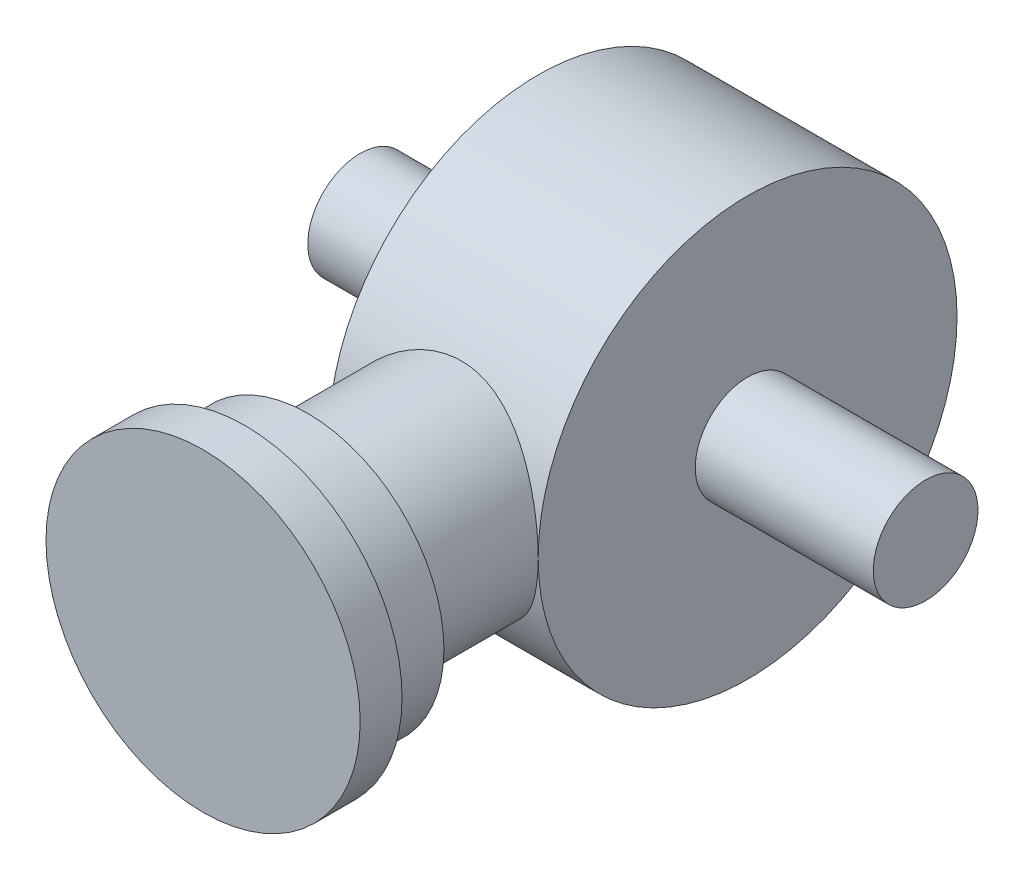
ISO-10303-21;
HEADER;
FILE_DESCRIPTION(('STEP AP214'),'2;1');
FILE_NAME('part.step','',(''),(''),'','','');
FILE_SCHEMA(('AUTOMOTIVE_DESIGN { 1 0 10303 214 1 1 1 1 }'));
ENDSEC;
DATA;
#1=APPLICATION_CONTEXT('core data for automotive mechanical design processes');
#2=APPLICATION_PROTOCOL_DEFINITION('international standard','automotive_design',2000,#1);
#3=PRODUCT_CONTEXT('',#1,'mechanical');
#4=PRODUCT('Part','Part','',(#3));
#5=PRODUCT_RELATED_PRODUCT_CATEGORY('part','',(#4));
#6=PRODUCT_DEFINITION_FORMATION('','',#4);
#7=PRODUCT_DEFINITION_CONTEXT('part definition',#1,'design');
#8=PRODUCT_DEFINITION('design','',#6,#7);
#9=PRODUCT_DEFINITION_SHAPE('','',#8);
#10=(LENGTH_UNIT() NAMED_UNIT(*) SI_UNIT(.MILLI.,.METRE.));
#11=(NAMED_UNIT(*) PLANE_ANGLE_UNIT() SI_UNIT($,.RADIAN.));
#12=(NAMED_UNIT(*) SI_UNIT($,.STERADIAN.) SOLID_ANGLE_UNIT());
#13=UNCERTAINTY_MEASURE_WITH_UNIT(LENGTH_MEASURE(1.E-05),#10,'distance_accuracy_value','');
#14=(GEOMETRIC_REPRESENTATION_CONTEXT(3) GLOBAL_UNCERTAINTY_ASSIGNED_CONTEXT((#13)) GLOBAL_UNIT_ASSIGNED_CONTEXT((#10,
#11,#12)) REPRESENTATION_CONTEXT('',''));
#15=CARTESIAN_POINT('',(0.,0.,0.));
#16=DIRECTION('',(0.,0.,1.));
#17=DIRECTION('',(1.,0.,0.));
#18=AXIS2_PLACEMENT_3D('',#15,#16,#17);
#19=CARTESIAN_POINT('',(12.7,0.,0.));
#20=DIRECTION('',(1.,0.,0.));
#21=DIRECTION('',(0.,0.,-1.));
#22=AXIS2_PLACEMENT_3D('',#19,#20,#21);
#23=PLANE('',#22);
#24=CARTESIAN_POINT('',(12.7,0.,0.));
#25=DIRECTION('',(1.,0.,0.));
#26=DIRECTION('',(0.,0.,-1.));
#27=AXIS2_PLACEMENT_3D('',#24,#25,#26);
#28=CIRCLE('',#27,25.4);
#29=CARTESIAN_POINT('',(12.7,0.,25.4));
#30=VERTEX_POINT('',#29);
#31=EDGE_CURVE('E47',#30,#30,#28,.T.);
#32=ORIENTED_EDGE('',*,*,#31,.T.);
#33=EDGE_LOOP('',(#32));
#34=FACE_BOUND('',#33,.T.);
#35=CARTESIAN_POINT('',(12.7,0.,0.));
#36=DIRECTION('',(1.,0.,0.));
#37=DIRECTION('',(0.,0.,-1.));
#38=AXIS2_PLACEMENT_3D('',#35,#36,#37);
#39=CIRCLE('',#38,6.35);
#40=CARTESIAN_POINT('',(12.7,0.,-6.35));
#41=VERTEX_POINT('',#40);
#42=EDGE_CURVE('E142',#41,#41,#39,.F.);
#43=ORIENTED_EDGE('',*,*,#42,.T.);
#44=EDGE_LOOP('',(#43));
#45=FACE_BOUND('',#44,.T.);
#46=ADVANCED_FACE('F39',(#34,#45),#23,.T.);
#47=CARTESIAN_POINT('',(-12.7,0.,0.));
#48=DIRECTION('',(1.,0.,0.));
#49=DIRECTION('',(0.,0.,-1.));
#50=AXIS2_PLACEMENT_3D('',#47,#48,#49);
#51=PLANE('',#50);
#52=CARTESIAN_POINT('',(-12.7,0.,0.));
#53=DIRECTION('',(1.,0.,0.));
#54=DIRECTION('',(0.,0.,-1.));
#55=AXIS2_PLACEMENT_3D('',#52,#53,#54);
#56=CIRCLE('',#55,25.4);
#57=CARTESIAN_POINT('',(-12.7,0.,25.4));
#58=VERTEX_POINT('',#57);
#59=EDGE_CURVE('E64',#58,#58,#56,.T.);
#60=ORIENTED_EDGE('',*,*,#59,.F.);
#61=EDGE_LOOP('',(#60));
#62=FACE_BOUND('',#61,.T.);
#63=CARTESIAN_POINT('',(-12.7,0.,0.));
#64=DIRECTION('',(1.,0.,0.));
#65=DIRECTION('',(0.,0.,-1.));
#66=AXIS2_PLACEMENT_3D('',#63,#64,#65);
#67=CIRCLE('',#66,6.35);
#68=CARTESIAN_POINT('',(-12.7,0.,-6.35));
#69=VERTEX_POINT('',#68);
#70=EDGE_CURVE('E11',#69,#69,#67,.F.);
#71=ORIENTED_EDGE('',*,*,#70,.F.);
#72=EDGE_LOOP('',(#71));
#73=FACE_BOUND('',#72,.T.);
#74=ADVANCED_FACE('F81',(#62,#73),#51,.F.);
#75=CARTESIAN_POINT('',(12.7,0.,0.));
#76=DIRECTION('',(-1.,0.,0.));
#77=DIRECTION('',(0.,0.,1.));
#78=AXIS2_PLACEMENT_3D('',#75,#76,#77);
#79=CYLINDRICAL_SURFACE('',#78,25.4);
#80=ORIENTED_EDGE('',*,*,#31,.F.);
#81=CARTESIAN_POINT('',(-12.7,0.,25.4));
#82=CARTESIAN_POINT('',(-12.7000075320675,-0.334227902540558,25.4000065559516));
#83=CARTESIAN_POINT('',(-12.6867979012213,-0.668377176531978,25.3933919823737));
#84=CARTESIAN_POINT('',(-12.6341366418875,-1.33418963602366,25.3671214717048));
#85=CARTESIAN_POINT('',(-12.5946796303352,-1.66585229743219,25.3474628594192));
#86=CARTESIAN_POINT('',(-12.4899419134687,-2.32435599102743,25.2955844242962));
#87=CARTESIAN_POINT('',(-12.424638541787,-2.65119252920193,25.2633535764008));
#88=CARTESIAN_POINT('',(-12.2689651877478,-3.29741527842774,25.1871574730545));
#89=CARTESIAN_POINT('',(-12.1785962430799,-3.61680179730913,25.1431927033792));
#90=CARTESIAN_POINT('',(-11.974116779298,-4.2449063490143,25.0447893859015));
#91=CARTESIAN_POINT('',(-11.8600926296096,-4.55365855597044,24.9903889934153));
#92=CARTESIAN_POINT('',(-11.6091906119499,-5.15987551395868,24.8722950084793));
#93=CARTESIAN_POINT('',(-11.4723125768133,-5.45734018240831,24.8086013480541));
#94=CARTESIAN_POINT('',(-11.176878389856,-6.03936145574322,24.6733736675621));
#95=CARTESIAN_POINT('',(-11.018325792984,-6.32392016722454,24.6018409336002));
#96=CARTESIAN_POINT('',(-10.6806250260259,-6.87894063563299,24.4524602707319));
#97=CARTESIAN_POINT('',(-10.5014687345593,-7.14939677226153,24.3746098551618));
#98=CARTESIAN_POINT('',(-10.1123653859141,-7.69075896614907,24.2094415482836));
#99=CARTESIAN_POINT('',(-9.90121395419657,-7.96071182540918,24.1218358475485));
#100=CARTESIAN_POINT('',(-9.45837742405131,-8.48210489403275,23.9434715823924));
#101=CARTESIAN_POINT('',(-9.22669115251155,-8.73354404424297,23.8527128380249));
#102=CARTESIAN_POINT('',(-8.74387729502205,-9.21690636029106,23.6701377759067));
#103=CARTESIAN_POINT('',(-8.49273840730742,-9.44881801508121,23.5783208701441));
#104=CARTESIAN_POINT('',(-7.9722852736554,-9.89189022407132,23.3958955130604));
#105=CARTESIAN_POINT('',(-7.70296762760132,-10.1030468780581,23.3052872916258));
#106=CARTESIAN_POINT('',(-7.12572522534577,-10.5190426808317,23.1206721884566));
#107=CARTESIAN_POINT('',(-6.81642729901838,-10.722108382666,23.0269503792836));
#108=CARTESIAN_POINT('',(-6.17987527381863,-11.1011846654923,22.8466136912253));
#109=CARTESIAN_POINT('',(-5.85262886439004,-11.2772067114832,22.7599958079733));
#110=CARTESIAN_POINT('',(-5.18198539960591,-11.6006709887549,22.5968417352572));
#111=CARTESIAN_POINT('',(-4.83859320751063,-11.7481217583055,22.5203025360663));
#112=CARTESIAN_POINT('',(-4.13780625649295,-12.0128599695755,22.3802068967669));
#113=CARTESIAN_POINT('',(-3.78041305417769,-12.1301507535227,22.3166490182729));
#114=CARTESIAN_POINT('',(-3.07604833735258,-12.3269432039937,22.2085191620235));
#115=CARTESIAN_POINT('',(-2.72973094592115,-12.4082846993322,22.1630393639196));
#116=CARTESIAN_POINT('',(-2.02982189876392,-12.5417986015641,22.0877611180317));
#117=CARTESIAN_POINT('',(-1.6762305548821,-12.5939722562307,22.0579619994459));
#118=CARTESIAN_POINT('',(-0.96518375422673,-12.6683105095499,22.0153527095978));
#119=CARTESIAN_POINT('',(-0.607731812938301,-12.6905004140932,22.0025282121657));
#120=CARTESIAN_POINT('',(0.107952254182772,-12.7045821886231,21.9944009953394));
#121=CARTESIAN_POINT('',(0.466184302321151,-12.6964769492485,21.9990966042482));
#122=CARTESIAN_POINT('',(1.13723108890566,-12.6528993792404,22.0241829776112));
#123=CARTESIAN_POINT('',(1.45034682063444,-12.6208209661067,22.0426266371524));
#124=CARTESIAN_POINT('',(2.07231407933172,-12.5337185881529,22.0922704378058));
#125=CARTESIAN_POINT('',(2.38116600363987,-12.4786967765199,22.1234693818575));
#126=CARTESIAN_POINT('',(2.99267158297998,-12.3463282910739,22.1976105957889));
#127=CARTESIAN_POINT('',(3.29532367433411,-12.2689760577109,22.2405557899634));
#128=CARTESIAN_POINT('',(3.89259360942259,-12.092753050119,22.3368617539041));
#129=CARTESIAN_POINT('',(4.18721102450074,-11.9938811303156,22.3902230781448));
#130=CARTESIAN_POINT('',(4.77356282527102,-11.7729988331913,22.5071646450358));
#131=CARTESIAN_POINT('',(5.06507453849555,-11.6505079979382,22.5709519354986));
#132=CARTESIAN_POINT('',(5.63682334806746,-11.3848861086522,22.7060910151595));
#133=CARTESIAN_POINT('',(5.91705644485921,-11.2417478138017,22.7774454557324));
#134=CARTESIAN_POINT('',(6.46503869042597,-10.9358020974744,22.9259054053455));
#135=CARTESIAN_POINT('',(6.73278547462078,-10.7729909712739,23.0030119965627));
#136=CARTESIAN_POINT('',(7.25471311876847,-10.4286571509734,23.1611528599823));
#137=CARTESIAN_POINT('',(7.50889422741349,-10.2471348000751,23.24218706013));
#138=CARTESIAN_POINT('',(8.03412008592087,-9.84207297352222,23.4168358517742));
#139=CARTESIAN_POINT('',(8.3032140527838,-9.61612448151882,23.5107423630467));
#140=CARTESIAN_POINT('',(8.8217271356287,-9.14277711997622,23.6988288138651));
#141=CARTESIAN_POINT('',(9.07114536218596,-8.89537728180754,23.7930087655724));
#142=CARTESIAN_POINT('',(9.54914614270668,-8.38017609008464,23.9793185349373));
#143=CARTESIAN_POINT('',(9.77771591314374,-8.11236240176926,24.071447068919));
#144=CARTESIAN_POINT('',(10.2124993424938,-7.55771398717195,24.2513085020062));
#145=CARTESIAN_POINT('',(10.4187102255638,-7.27087690625479,24.3390408546028));
#146=CARTESIAN_POINT('',(10.8164945006183,-6.66563477362501,24.5118941448025));
#147=CARTESIAN_POINT('',(11.0069150602108,-6.3463784083698,24.5966955591839));
#148=CARTESIAN_POINT('',(11.3598081577092,-5.6906350303462,24.7566255804175));
#149=CARTESIAN_POINT('',(11.5222930334197,-5.35415570975233,24.8317584536776));
#150=CARTESIAN_POINT('',(11.8174897683826,-4.666549811546,24.9701035721987));
#151=CARTESIAN_POINT('',(11.9502423373637,-4.31544405203666,25.0333320978423));
#152=CARTESIAN_POINT('',(12.1845846050113,-3.60100265413862,25.1460448564883));
#153=CARTESIAN_POINT('',(12.2861862911563,-3.23767178009931,25.1955343758384));
#154=CARTESIAN_POINT('',(12.480103071579,-2.40159814107709,25.290588646216));
#155=CARTESIAN_POINT('',(12.5623989100097,-1.92594379089569,25.3314357023151));
#156=CARTESIAN_POINT('',(12.6723392204265,-0.966804298745561,25.386135301499));
#157=CARTESIAN_POINT('',(12.6999891080356,-0.483319937549359,25.3999905195763));
#158=CARTESIAN_POINT('',(12.7000075320675,0.334227902540558,25.4000065559516));
#159=CARTESIAN_POINT('',(12.6867979012213,0.668377176531978,25.3933919823737));
#160=CARTESIAN_POINT('',(12.6341366418875,1.33418963602366,25.3671214717048));
#161=CARTESIAN_POINT('',(12.5946796303352,1.66585229743219,25.3474628594192));
#162=CARTESIAN_POINT('',(12.4899419134687,2.32435599102743,25.2955844242962));
#163=CARTESIAN_POINT('',(12.424638541787,2.65119252920192,25.2633535764008));
#164=CARTESIAN_POINT('',(12.2689651877478,3.29741527842774,25.1871574730545));
#165=CARTESIAN_POINT('',(12.1785962430799,3.61680179730913,25.1431927033792));
#166=CARTESIAN_POINT('',(11.974116779298,4.2449063490143,25.0447893859015));
#167=CARTESIAN_POINT('',(11.8600926296096,4.55365855597044,24.9903889934153));
#168=CARTESIAN_POINT('',(11.6091906119498,5.15987551395868,24.8722950084793));
#169=CARTESIAN_POINT('',(11.4723125768133,5.45734018240831,24.8086013480541));
#170=CARTESIAN_POINT('',(11.176878389856,6.03936145574322,24.6733736675621));
#171=CARTESIAN_POINT('',(11.018325792984,6.32392016722454,24.6018409336002));
#172=CARTESIAN_POINT('',(10.6806250260259,6.87894063563299,24.4524602707319));
#173=CARTESIAN_POINT('',(10.5014687345593,7.14939677226153,24.3746098551618));
#174=CARTESIAN_POINT('',(10.1123653859141,7.69075896614907,24.2094415482836));
#175=CARTESIAN_POINT('',(9.90121395419657,7.96071182540918,24.1218358475485));
#176=CARTESIAN_POINT('',(9.45837742405131,8.48210489403275,23.9434715823923));
#177=CARTESIAN_POINT('',(9.22669115251155,8.73354404424297,23.8527128380249));
#178=CARTESIAN_POINT('',(8.74387729502205,9.21690636029106,23.6701377759067));
#179=CARTESIAN_POINT('',(8.49273840730742,9.44881801508121,23.5783208701441));
#180=CARTESIAN_POINT('',(7.9722852736554,9.89189022407132,23.3958955130604));
#181=CARTESIAN_POINT('',(7.70296762760132,10.1030468780581,23.3052872916258));
#182=CARTESIAN_POINT('',(7.12572522534577,10.5190426808317,23.1206721884566));
#183=CARTESIAN_POINT('',(6.81642729901838,10.722108382666,23.0269503792836));
#184=CARTESIAN_POINT('',(6.17987527381863,11.1011846654923,22.8466136912253));
#185=CARTESIAN_POINT('',(5.85262886439004,11.2772067114832,22.7599958079733));
#186=CARTESIAN_POINT('',(5.18198539960591,11.6006709887549,22.5968417352572));
#187=CARTESIAN_POINT('',(4.83859320751063,11.7481217583055,22.5203025360663));
#188=CARTESIAN_POINT('',(4.13780625649295,12.0128599695755,22.3802068967669));
#189=CARTESIAN_POINT('',(3.78041305417769,12.1301507535227,22.3166490182729));
#190=CARTESIAN_POINT('',(3.07604833735258,12.3269432039937,22.2085191620235));
#191=CARTESIAN_POINT('',(2.72973094592115,12.4082846993322,22.1630393639196));
#192=CARTESIAN_POINT('',(2.02982189876392,12.5417986015641,22.0877611180317));
#193=CARTESIAN_POINT('',(1.6762305548821,12.5939722562307,22.0579619994459));
#194=CARTESIAN_POINT('',(0.965183754226729,12.6683105095499,22.0153527095978));
#195=CARTESIAN_POINT('',(0.607731812938299,12.6905004140932,22.0025282121657));
#196=CARTESIAN_POINT('',(-0.107952254182773,12.7045821886231,21.9944009953394));
#197=CARTESIAN_POINT('',(-0.466184302321151,12.6964769492485,21.9990966042482));
#198=CARTESIAN_POINT('',(-1.13723108890566,12.6528993792404,22.0241829776112));
#199=CARTESIAN_POINT('',(-1.45034682063444,12.6208209661067,22.0426266371524));
#200=CARTESIAN_POINT('',(-2.07231407933172,12.5337185881529,22.0922704378058));
#201=CARTESIAN_POINT('',(-2.38116600363987,12.4786967765199,22.1234693818575));
#202=CARTESIAN_POINT('',(-2.99267158297997,12.3463282910739,22.1976105957889));
#203=CARTESIAN_POINT('',(-3.29532367433411,12.2689760577109,22.2405557899634));
#204=CARTESIAN_POINT('',(-3.89259360942259,12.092753050119,22.3368617539041));
#205=CARTESIAN_POINT('',(-4.18721102450074,11.9938811303156,22.3902230781448));
#206=CARTESIAN_POINT('',(-4.77356282527101,11.7729988331913,22.5071646450358));
#207=CARTESIAN_POINT('',(-5.06507453849555,11.6505079979382,22.5709519354986));
#208=CARTESIAN_POINT('',(-5.63682334806746,11.3848861086522,22.7060910151595));
#209=CARTESIAN_POINT('',(-5.91705644485921,11.2417478138017,22.7774454557324));
#210=CARTESIAN_POINT('',(-6.46503869042597,10.9358020974744,22.9259054053455));
#211=CARTESIAN_POINT('',(-6.73278547462077,10.7729909712739,23.0030119965627));
#212=CARTESIAN_POINT('',(-7.25471311876847,10.4286571509734,23.1611528599823));
#213=CARTESIAN_POINT('',(-7.50889422741349,10.2471348000751,23.24218706013));
#214=CARTESIAN_POINT('',(-8.03412008592087,9.84207297352222,23.4168358517742));
#215=CARTESIAN_POINT('',(-8.3032140527838,9.61612448151882,23.5107423630467));
#216=CARTESIAN_POINT('',(-8.8217271356287,9.14277711997623,23.6988288138651));
#217=CARTESIAN_POINT('',(-9.07114536218596,8.89537728180754,23.7930087655724));
#218=CARTESIAN_POINT('',(-9.54914614270667,8.38017609008464,23.9793185349373));
#219=CARTESIAN_POINT('',(-9.77771591314373,8.11236240176927,24.071447068919));
#220=CARTESIAN_POINT('',(-10.2124993424938,7.55771398717195,24.2513085020062));
#221=CARTESIAN_POINT('',(-10.4187102255638,7.27087690625479,24.3390408546028));
#222=CARTESIAN_POINT('',(-10.8164945006183,6.66563477362501,24.5118941448025));
#223=CARTESIAN_POINT('',(-11.0069150602108,6.34637840836979,24.5966955591839));
#224=CARTESIAN_POINT('',(-11.3598081577092,5.69063503034619,24.7566255804175));
#225=CARTESIAN_POINT('',(-11.5222930334197,5.35415570975232,24.8317584536776));
#226=CARTESIAN_POINT('',(-11.8174897683826,4.666549811546,24.9701035721987));
#227=CARTESIAN_POINT('',(-11.9502423373637,4.31544405203666,25.0333320978423));
#228=CARTESIAN_POINT('',(-12.1845846050113,3.60100265413861,25.1460448564883));
#229=CARTESIAN_POINT('',(-12.2861862911563,3.23767178009931,25.1955343758384));
#230=CARTESIAN_POINT('',(-12.480103071579,2.40159814107709,25.290588646216));
#231=CARTESIAN_POINT('',(-12.5623989100097,1.92594379089569,25.3314357023151));
#232=CARTESIAN_POINT('',(-12.6723392204265,0.966804298745556,25.386135301499));
#233=CARTESIAN_POINT('',(-12.6999891080356,0.483319937549357,25.3999905195763));
#234=CARTESIAN_POINT('',(-12.7,0.,25.4));
#235=B_SPLINE_CURVE_WITH_KNOTS('',3,(#81,#82,#83,#84,#85,#86,#87,#88,#89,#90,#91,#92,#93,#94,
#95,#96,#97,#98,#99,#100,#101,#102,#103,#104,#105,#106,#107,#108,#109,#110,#111,#112,#113,#114,
#115,#116,#117,#118,#119,#120,#121,#122,#123,#124,#125,#126,#127,#128,#129,#130,#131,#132,#133,
#134,#135,#136,#137,#138,#139,#140,#141,#142,#143,#144,#145,#146,#147,#148,#149,#150,#151,#152,
#153,#154,#155,#156,#157,#158,#159,#160,#161,#162,#163,#164,#165,#166,#167,#168,#169,#170,#171,
#172,#173,#174,#175,#176,#177,#178,#179,#180,#181,#182,#183,#184,#185,#186,#187,#188,#189,#190,
#191,#192,#193,#194,#195,#196,#197,#198,#199,#200,#201,#202,#203,#204,#205,#206,#207,#208,#209,
#210,#211,#212,#213,#214,#215,#216,#217,#218,#219,#220,#221,#222,#223,#224,#225,#226,#227,#228,
#229,#230,#231,#232,#233,#234),.UNSPECIFIED.,.T.,.F.,(4,2,2,2,2,2,2,2,2,2,2,2,2,2,2,2,2,2,2,2,2,
2,2,2,2,2,2,2,2,2,2,2,2,2,2,2,2,2,2,2,2,2,2,2,2,2,2,2,2,2,2,2,2,2,2,2,2,2,2,2,2,2,2,2,2,2,2,2,2,
2,2,2,2,2,2,2,4),(0.,1.00222375260369,2.00465311426946,3.00796352675839,4.01123240939895,
5.0109006883724,6.01057627976055,7.01008810584387,8.00999526972287,9.07010118408974,
10.1302676991514,11.1910548476781,12.2520409563423,13.3956759388577,14.5388247381891,
15.6816313890958,16.8243113433993,17.8986842268624,18.9730111461313,20.0464307800791,
21.1197479953307,22.0645179440158,23.0091992480778,23.9541159502457,24.8990829662208,
25.8658135403799,26.832883963357,27.8001367865491,28.7673718715284,29.857299251817,
30.9472758731248,32.0379163983348,33.1286921712796,34.2710336982866,35.4128694064703,
36.5531320134575,37.6929552724024,39.1423936058724,40.5916882872467,41.5939120398504,
42.5963414015161,43.5996518140051,44.6029206966456,45.6025889756191,46.6022645670072,
47.6017763930905,48.6016835569695,49.6617894713364,50.7219559863981,51.7827431349247,
52.843729243589,53.9873642261043,55.1305130254358,56.2733196763425,57.415999630646,
58.4903725141091,59.564699433378,60.6381190673258,61.7114362825774,62.6562062312625,
63.6008875353245,64.5458042374924,65.4907712534675,66.4575018276265,67.4245722506036,
68.3918250737958,69.3590601587751,70.4489875390637,71.5389641603715,72.6296046855815,
73.7203804585263,74.8627219855333,76.004557693717,77.1448203007042,78.2846435596491,
79.7340818931191,81.1833765744934),.UNSPECIFIED.);
#236=EDGE_CURVE('E53',#58,#30,#235,.T.);
#237=ORIENTED_EDGE('',*,*,#236,.F.);
#238=ORIENTED_EDGE('',*,*,#59,.T.);
#239=EDGE_CURVE('E55',#30,#58,#235,.T.);
#240=ORIENTED_EDGE('',*,*,#239,.F.);
#241=EDGE_LOOP('',(#80,#237,#238,#240));
#242=FACE_BOUND('',#241,.T.);
#243=ADVANCED_FACE('F41',(#242),#79,.T.);
#244=CARTESIAN_POINT('',(0.,0.,-25.401));
#245=DIRECTION('',(0.,0.,1.));
#246=DIRECTION('',(1.,0.,0.));
#247=AXIS2_PLACEMENT_3D('',#244,#245,#246);
#248=CYLINDRICAL_SURFACE('',#247,12.7);
#249=CARTESIAN_POINT('',(0.,0.,40.64));
#250=DIRECTION('',(0.,0.,1.));
#251=DIRECTION('',(1.,0.,0.));
#252=AXIS2_PLACEMENT_3D('',#249,#250,#251);
#253=CIRCLE('',#252,12.7);
#254=CARTESIAN_POINT('',(12.7,0.,40.64));
#255=VERTEX_POINT('',#254);
#256=EDGE_CURVE('E65',#255,#255,#253,.T.);
#257=ORIENTED_EDGE('',*,*,#256,.F.);
#258=EDGE_LOOP('',(#257));
#259=FACE_BOUND('',#258,.T.);
#260=ORIENTED_EDGE('',*,*,#236,.T.);
#261=ORIENTED_EDGE('',*,*,#239,.T.);
#262=EDGE_LOOP('',(#260,#261));
#263=FACE_BOUND('',#262,.T.);
#264=ADVANCED_FACE('F56',(#259,#263),#248,.T.);
#265=CARTESIAN_POINT('',(0.,0.,48.26));
#266=DIRECTION('',(0.,0.,-1.));
#267=DIRECTION('',(-1.,0.,0.));
#268=AXIS2_PLACEMENT_3D('',#265,#266,#267);
#269=CYLINDRICAL_SURFACE('',#268,16.51);
#270=CARTESIAN_POINT('',(0.,0.,48.26));
#271=DIRECTION('',(0.,0.,1.));
#272=DIRECTION('',(1.,0.,0.));
#273=AXIS2_PLACEMENT_3D('',#270,#271,#272);
#274=CIRCLE('',#273,16.51);
#275=CARTESIAN_POINT('',(-16.51,0.,48.26));
#276=VERTEX_POINT('',#275);
#277=EDGE_CURVE('E61',#276,#276,#274,.T.);
#278=CARTESIAN_POINT('',(0.,0.,40.64));
#279=DIRECTION('',(0.,0.,1.));
#280=DIRECTION('',(1.,0.,0.));
#281=AXIS2_PLACEMENT_3D('',#278,#279,#280);
#282=CIRCLE('',#281,16.51);
#283=CARTESIAN_POINT('',(-16.51,0.,40.64));
#284=VERTEX_POINT('',#283);
#285=EDGE_CURVE('E73',#284,#284,#282,.T.);
#286=CARTESIAN_POINT('',(-16.51,0.,48.26));
#287=CARTESIAN_POINT('',(-16.51,0.,48.180625));
#288=CARTESIAN_POINT('',(-16.51,0.,48.10125));
#289=CARTESIAN_POINT('',(-16.51,0.,47.9425));
#290=CARTESIAN_POINT('',(-16.51,0.,47.863125));
#291=CARTESIAN_POINT('',(-16.51,0.,47.704375));
#292=CARTESIAN_POINT('',(-16.51,0.,47.625));
#293=CARTESIAN_POINT('',(-16.51,0.,47.46625));
#294=CARTESIAN_POINT('',(-16.51,0.,47.386875));
#295=CARTESIAN_POINT('',(-16.51,0.,47.228125));
#296=CARTESIAN_POINT('',(-16.51,0.,47.14875));
#297=CARTESIAN_POINT('',(-16.51,0.,46.99));
#298=CARTESIAN_POINT('',(-16.51,0.,46.910625));
#299=CARTESIAN_POINT('',(-16.51,0.,46.751875));
#300=CARTESIAN_POINT('',(-16.51,0.,46.6725));
#301=CARTESIAN_POINT('',(-16.51,0.,46.51375));
#302=CARTESIAN_POINT('',(-16.51,0.,46.434375));
#303=CARTESIAN_POINT('',(-16.51,0.,46.275625));
#304=CARTESIAN_POINT('',(-16.51,0.,46.19625));
#305=CARTESIAN_POINT('',(-16.51,0.,46.0375));
#306=CARTESIAN_POINT('',(-16.51,0.,45.958125));
#307=CARTESIAN_POINT('',(-16.51,0.,45.799375));
#308=CARTESIAN_POINT('',(-16.51,0.,45.72));
#309=CARTESIAN_POINT('',(-16.51,0.,45.56125));
#310=CARTESIAN_POINT('',(-16.51,0.,45.481875));
#311=CARTESIAN_POINT('',(-16.51,0.,45.323125));
#312=CARTESIAN_POINT('',(-16.51,0.,45.24375));
#313=CARTESIAN_POINT('',(-16.51,0.,45.085));
#314=CARTESIAN_POINT('',(-16.51,0.,45.005625));
#315=CARTESIAN_POINT('',(-16.51,0.,44.846875));
#316=CARTESIAN_POINT('',(-16.51,0.,44.7675));
#317=CARTESIAN_POINT('',(-16.51,0.,44.60875));
#318=CARTESIAN_POINT('',(-16.51,0.,44.529375));
#319=CARTESIAN_POINT('',(-16.51,0.,44.370625));
#320=CARTESIAN_POINT('',(-16.51,0.,44.29125));
#321=CARTESIAN_POINT('',(-16.51,0.,44.1325));
#322=CARTESIAN_POINT('',(-16.51,0.,44.053125));
#323=CARTESIAN_POINT('',(-16.51,0.,43.894375));
#324=CARTESIAN_POINT('',(-16.51,0.,43.815));
#325=CARTESIAN_POINT('',(-16.51,0.,43.65625));
#326=CARTESIAN_POINT('',(-16.51,0.,43.576875));
#327=CARTESIAN_POINT('',(-16.51,0.,43.418125));
#328=CARTESIAN_POINT('',(-16.51,0.,43.33875));
#329=CARTESIAN_POINT('',(-16.51,0.,43.18));
#330=CARTESIAN_POINT('',(-16.51,0.,43.100625));
#331=CARTESIAN_POINT('',(-16.51,0.,42.941875));
#332=CARTESIAN_POINT('',(-16.51,0.,42.8625));
#333=CARTESIAN_POINT('',(-16.51,0.,42.70375));
#334=CARTESIAN_POINT('',(-16.51,0.,42.624375));
#335=CARTESIAN_POINT('',(-16.51,0.,42.465625));
#336=CARTESIAN_POINT('',(-16.51,0.,42.38625));
#337=CARTESIAN_POINT('',(-16.51,0.,42.2275));
#338=CARTESIAN_POINT('',(-16.51,0.,42.148125));
#339=CARTESIAN_POINT('',(-16.51,0.,41.989375));
#340=CARTESIAN_POINT('',(-16.51,0.,41.91));
#341=CARTESIAN_POINT('',(-16.51,0.,41.75125));
#342=CARTESIAN_POINT('',(-16.51,0.,41.671875));
#343=CARTESIAN_POINT('',(-16.51,0.,41.513125));
#344=CARTESIAN_POINT('',(-16.51,0.,41.43375));
#345=CARTESIAN_POINT('',(-16.51,0.,41.275));
#346=CARTESIAN_POINT('',(-16.51,0.,41.195625));
#347=CARTESIAN_POINT('',(-16.51,0.,41.036875));
#348=CARTESIAN_POINT('',(-16.51,0.,40.9575));
#349=CARTESIAN_POINT('',(-16.51,0.,40.79875));
#350=CARTESIAN_POINT('',(-16.51,0.,40.719375));
#351=CARTESIAN_POINT('',(-16.51,0.,40.64));
#352=B_SPLINE_CURVE_WITH_KNOTS('',3,(#286,#287,#288,#289,#290,#291,#292,#293,#294,#295,#296,
#297,#298,#299,#300,#301,#302,#303,#304,#305,#306,#307,#308,#309,#310,#311,#312,#313,#314,#315,
#316,#317,#318,#319,#320,#321,#322,#323,#324,#325,#326,#327,#328,#329,#330,#331,#332,#333,#334,
#335,#336,#337,#338,#339,#340,#341,#342,#343,#344,#345,#346,#347,#348,#349,#350,#351),
.UNSPECIFIED.,.F.,.F.,(4,2,2,2,2,2,2,2,2,2,2,2,2,2,2,2,2,2,2,2,2,2,2,2,2,2,2,2,2,2,2,2,4),(0.,
0.238125000000006,0.476250000000004,0.714375000000003,0.952500000000002,1.190625,
1.42875000000001,1.66687500000001,1.905,2.143125,2.38125,2.619375,2.85750000000001,3.095625,
3.33375,3.571875,3.81,4.04812500000001,4.28625000000001,4.524375,4.7625,5.000625,
5.23875000000001,5.47687500000001,5.71500000000001,5.953125,6.19125,6.429375,6.66750000000001,
6.90562500000001,7.14375,7.381875,7.62),.UNSPECIFIED.);
#353=EDGE_CURVE('BSEAM122',#276,#284,#352,.T.);
#354=ORIENTED_EDGE('',*,*,#277,.F.);
#355=ORIENTED_EDGE('',*,*,#285,.T.);
#356=ORIENTED_EDGE('',*,*,#353,.T.);
#357=ORIENTED_EDGE('',*,*,#353,.F.);
#358=EDGE_LOOP('',(#354,#356,#355,#357));
#359=FACE_BOUND('',#358,.T.);
#360=ADVANCED_FACE('F122',(#359),#269,.T.);
#361=CARTESIAN_POINT('',(0.,0.,40.64));
#362=DIRECTION('',(0.,0.,1.));
#363=DIRECTION('',(1.,0.,0.));
#364=AXIS2_PLACEMENT_3D('',#361,#362,#363);
#365=PLANE('',#364);
#366=ORIENTED_EDGE('',*,*,#256,.T.);
#367=EDGE_LOOP('',(#366));
#368=FACE_BOUND('',#367,.T.);
#369=ORIENTED_EDGE('',*,*,#285,.F.);
#370=EDGE_LOOP('',(#369));
#371=FACE_BOUND('',#370,.T.);
#372=ADVANCED_FACE('F116',(#368,#371),#365,.F.);
#373=CARTESIAN_POINT('',(0.,0.,48.26));
#374=DIRECTION('',(0.,0.,1.));
#375=DIRECTION('',(1.,0.,0.));
#376=AXIS2_PLACEMENT_3D('',#373,#374,#375);
#377=PLANE('',#376);
#378=CARTESIAN_POINT('',(0.,0.,48.26));
#379=DIRECTION('',(0.,0.,1.));
#380=DIRECTION('',(1.,0.,0.));
#381=AXIS2_PLACEMENT_3D('',#378,#379,#380);
#382=CIRCLE('',#381,19.05);
#383=CARTESIAN_POINT('',(19.05,0.,48.26));
#384=VERTEX_POINT('',#383);
#385=EDGE_CURVE('E138',#384,#384,#382,.T.);
#386=ORIENTED_EDGE('',*,*,#385,.F.);
#387=EDGE_LOOP('',(#386));
#388=FACE_BOUND('',#387,.T.);
#389=ORIENTED_EDGE('',*,*,#277,.T.);
#390=EDGE_LOOP('',(#389));
#391=FACE_BOUND('',#390,.T.);
#392=ADVANCED_FACE('F113',(#388,#391),#377,.F.);
#393=CARTESIAN_POINT('',(0.,0.,53.34));
#394=DIRECTION('',(0.,0.,-1.));
#395=DIRECTION('',(-1.,0.,0.));
#396=AXIS2_PLACEMENT_3D('',#393,#394,#395);
#397=CYLINDRICAL_SURFACE('',#396,19.05);
#398=CARTESIAN_POINT('',(0.,0.,53.34));
#399=DIRECTION('',(0.,0.,1.));
#400=DIRECTION('',(1.,0.,0.));
#401=AXIS2_PLACEMENT_3D('',#398,#399,#400);
#402=CIRCLE('',#401,19.05);
#403=CARTESIAN_POINT('',(19.05,0.,53.34));
#404=VERTEX_POINT('',#403);
#405=EDGE_CURVE('E136',#404,#404,#402,.T.);
#406=ORIENTED_EDGE('',*,*,#405,.F.);
#407=EDGE_LOOP('',(#406));
#408=FACE_BOUND('',#407,.T.);
#409=ORIENTED_EDGE('',*,*,#385,.T.);
#410=EDGE_LOOP('',(#409));
#411=FACE_BOUND('',#410,.T.);
#412=ADVANCED_FACE('F111',(#408,#411),#397,.T.);
#413=CARTESIAN_POINT('',(0.,0.,53.34));
#414=DIRECTION('',(0.,0.,1.));
#415=DIRECTION('',(1.,0.,0.));
#416=AXIS2_PLACEMENT_3D('',#413,#414,#415);
#417=PLANE('',#416);
#418=ORIENTED_EDGE('',*,*,#405,.T.);
#419=EDGE_LOOP('',(#418));
#420=FACE_BOUND('',#419,.T.);
#421=ADVANCED_FACE('F103',(#420),#417,.T.);
#422=CARTESIAN_POINT('',(-34.29,0.,0.));
#423=DIRECTION('',(1.,0.,0.));
#424=DIRECTION('',(0.,0.,-1.));
#425=AXIS2_PLACEMENT_3D('',#422,#423,#424);
#426=PLANE('',#425);
#427=CARTESIAN_POINT('',(-34.29,0.,0.));
#428=DIRECTION('',(1.,0.,0.));
#429=DIRECTION('',(0.,0.,-1.));
#430=AXIS2_PLACEMENT_3D('',#427,#428,#429);
#431=CIRCLE('',#430,6.35);
#432=CARTESIAN_POINT('',(-34.29,0.,-6.35));
#433=VERTEX_POINT('',#432);
#434=EDGE_CURVE('E148',#433,#433,#431,.T.);
#435=ORIENTED_EDGE('',*,*,#434,.F.);
#436=EDGE_LOOP('',(#435));
#437=FACE_BOUND('',#436,.T.);
#438=ADVANCED_FACE('F94',(#437),#426,.F.);
#439=CARTESIAN_POINT('',(34.29,0.,0.));
#440=DIRECTION('',(-1.,0.,0.));
#441=DIRECTION('',(0.,0.,1.));
#442=AXIS2_PLACEMENT_3D('',#439,#440,#441);
#443=CYLINDRICAL_SURFACE('',#442,6.35);
#444=ORIENTED_EDGE('',*,*,#434,.T.);
#445=EDGE_LOOP('',(#444));
#446=FACE_BOUND('',#445,.T.);
#447=ORIENTED_EDGE('',*,*,#70,.T.);
#448=EDGE_LOOP('',(#447));
#449=FACE_BOUND('',#448,.T.);
#450=ADVANCED_FACE('F91',(#446,#449),#443,.T.);
#451=ORIENTED_EDGE('',*,*,#42,.F.);
#452=EDGE_LOOP('',(#451));
#453=FACE_BOUND('',#452,.T.);
#454=CARTESIAN_POINT('',(34.29,0.,0.));
#455=DIRECTION('',(1.,0.,0.));
#456=DIRECTION('',(0.,0.,-1.));
#457=AXIS2_PLACEMENT_3D('',#454,#455,#456);
#458=CIRCLE('',#457,6.35);
#459=CARTESIAN_POINT('',(34.29,0.,-6.35));
#460=VERTEX_POINT('',#459);
#461=EDGE_CURVE('E147',#460,#460,#458,.T.);
#462=ORIENTED_EDGE('',*,*,#461,.F.);
#463=EDGE_LOOP('',(#462));
#464=FACE_BOUND('',#463,.T.);
#465=ADVANCED_FACE('F93',(#453,#464),#443,.T.);
#466=CARTESIAN_POINT('',(34.29,0.,0.));
#467=DIRECTION('',(1.,0.,0.));
#468=DIRECTION('',(0.,0.,-1.));
#469=AXIS2_PLACEMENT_3D('',#466,#467,#468);
#470=PLANE('',#469);
#471=ORIENTED_EDGE('',*,*,#461,.T.);
#472=EDGE_LOOP('',(#471));
#473=FACE_BOUND('',#472,.T.);
#474=ADVANCED_FACE('F101',(#473),#470,.T.);
#475=CLOSED_SHELL('',(#46,#74,#243,#264,#360,#372,#392,#412,#421,#438,#450,#465,#474));
#476=MANIFOLD_SOLID_BREP('B2',#475);
#477=ADVANCED_BREP_SHAPE_REPRESENTATION('',(#18,#476),#14);
#478=SHAPE_DEFINITION_REPRESENTATION(#9,#477);
ENDSEC;
END-ISO-10303-21;
